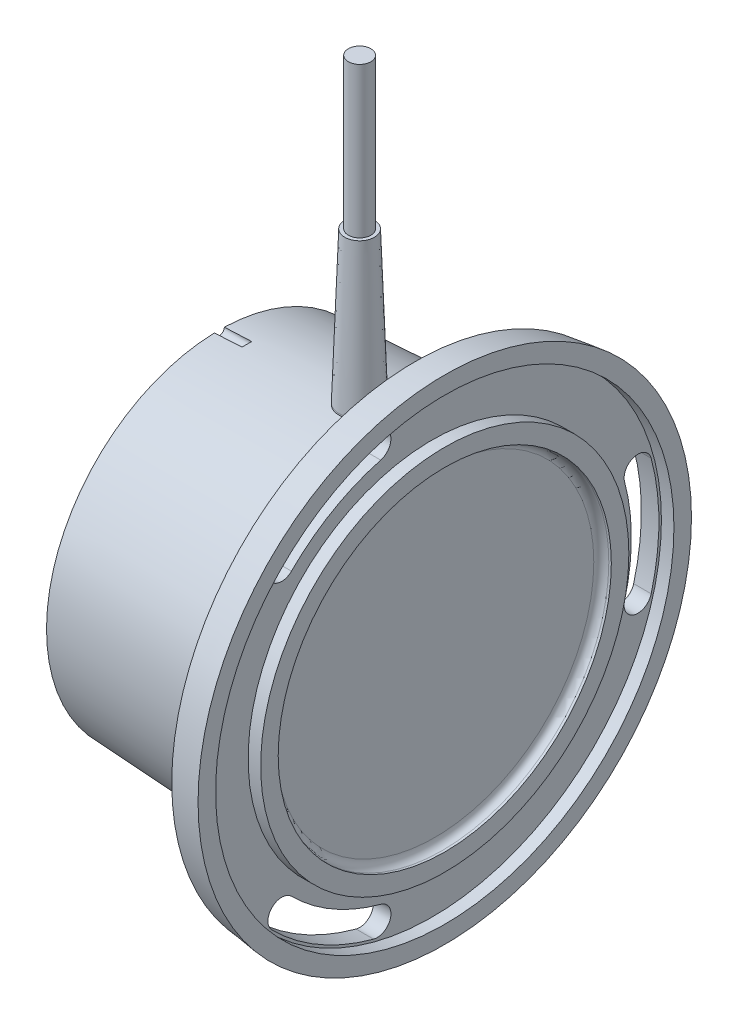
ISO-10303-21;
HEADER;
FILE_DESCRIPTION(('STEP AP214'),'2;1');
FILE_NAME('part.step','',(''),(''),'','','');
FILE_SCHEMA(('AUTOMOTIVE_DESIGN { 1 0 10303 214 1 1 1 1 }'));
ENDSEC;
DATA;
#1=APPLICATION_CONTEXT('core data for automotive mechanical design processes');
#2=APPLICATION_PROTOCOL_DEFINITION('international standard','automotive_design',2000,#1);
#3=PRODUCT_CONTEXT('',#1,'mechanical');
#4=PRODUCT('Part','Part','',(#3));
#5=PRODUCT_RELATED_PRODUCT_CATEGORY('part','',(#4));
#6=PRODUCT_DEFINITION_FORMATION('','',#4);
#7=PRODUCT_DEFINITION_CONTEXT('part definition',#1,'design');
#8=PRODUCT_DEFINITION('design','',#6,#7);
#9=PRODUCT_DEFINITION_SHAPE('','',#8);
#10=(LENGTH_UNIT() NAMED_UNIT(*) SI_UNIT(.MILLI.,.METRE.));
#11=(NAMED_UNIT(*) PLANE_ANGLE_UNIT() SI_UNIT($,.RADIAN.));
#12=(NAMED_UNIT(*) SI_UNIT($,.STERADIAN.) SOLID_ANGLE_UNIT());
#13=UNCERTAINTY_MEASURE_WITH_UNIT(LENGTH_MEASURE(1.E-05),#10,'distance_accuracy_value','');
#14=(GEOMETRIC_REPRESENTATION_CONTEXT(3) GLOBAL_UNCERTAINTY_ASSIGNED_CONTEXT((#13)) GLOBAL_UNIT_ASSIGNED_CONTEXT((#10,
#11,#12)) REPRESENTATION_CONTEXT('',''));
#15=CARTESIAN_POINT('',(0.,0.,0.));
#16=DIRECTION('',(0.,0.,1.));
#17=DIRECTION('',(1.,0.,0.));
#18=AXIS2_PLACEMENT_3D('',#15,#16,#17);
#19=CARTESIAN_POINT('',(28.,66.,0.));
#20=DIRECTION('',(0.,1.,0.));
#21=DIRECTION('',(0.,0.,1.));
#22=AXIS2_PLACEMENT_3D('',#19,#20,#21);
#23=PLANE('',#22);
#24=CARTESIAN_POINT('',(28.,66.,0.));
#25=DIRECTION('',(0.,1.,0.));
#26=DIRECTION('',(0.,0.,1.));
#27=AXIS2_PLACEMENT_3D('',#24,#25,#26);
#28=CIRCLE('',#27,2.95237691524758);
#29=CARTESIAN_POINT('',(28.,66.,2.95237691524758));
#30=VERTEX_POINT('',#29);
#31=EDGE_CURVE('E289',#30,#30,#28,.T.);
#32=ORIENTED_EDGE('',*,*,#31,.T.);
#33=EDGE_LOOP('',(#32));
#34=FACE_BOUND('',#33,.T.);
#35=CARTESIAN_POINT('',(28.,66.,0.));
#36=DIRECTION('',(0.,1.,0.));
#37=DIRECTION('',(0.,0.,1.));
#38=AXIS2_PLACEMENT_3D('',#35,#36,#37);
#39=CIRCLE('',#38,2.25);
#40=CARTESIAN_POINT('',(28.,66.,2.25));
#41=VERTEX_POINT('',#40);
#42=EDGE_CURVE('E281',#41,#41,#39,.T.);
#43=ORIENTED_EDGE('',*,*,#42,.F.);
#44=EDGE_LOOP('',(#43));
#45=FACE_BOUND('',#44,.T.);
#46=ADVANCED_FACE('F39',(#34,#45),#23,.T.);
#47=CARTESIAN_POINT('',(39.,0.,0.));
#48=DIRECTION('',(1.,0.,0.));
#49=DIRECTION('',(0.,0.,-1.));
#50=AXIS2_PLACEMENT_3D('',#47,#48,#49);
#51=CONICAL_SURFACE('',#50,36.5,0.0512371674034185);
#52=CARTESIAN_POINT('',(5.5002,34.7687218096424,-0.963217830515257));
#53=CARTESIAN_POINT('',(5.16734204294178,34.7515126146158,-0.968017715513699));
#54=CARTESIAN_POINT('',(4.83447649524155,34.7343156956424,-0.972319788754847));
#55=CARTESIAN_POINT('',(4.16873657126538,34.6999467406474,-0.979965061656519));
#56=CARTESIAN_POINT('',(3.83586219511793,34.6827747043679,-0.983308271328277));
#57=CARTESIAN_POINT('',(2.91914405483441,34.6355187324375,-0.991245575102052));
#58=CARTESIAN_POINT('',(2.33529050478183,34.6054605980492,-0.994882519406034));
#59=CARTESIAN_POINT('',(1.16755803085788,34.5454209802628,-0.999418047066386));
#60=CARTESIAN_POINT('',(0.583679106717657,34.5154394982784,-1.00031658027601));
#61=CARTESIAN_POINT('',(-0.000199999999913171,34.4854969899679,-0.999894825827186));
#62=B_SPLINE_CURVE_WITH_KNOTS('',3,(#52,#53,#54,#55,#56,#57,#58,#59,#60,#61),.UNSPECIFIED.,.F.,
.F.,(4,2,2,2,4),(0.,1.00001051321694,2.00001058521581,3.75391796812255,5.50785746900228),.UNSPECIFIED.);
#63=CARTESIAN_POINT('',(5.5,34.7687114693804,-0.963220715217156));
#64=VERTEX_POINT('',#63);
#65=CARTESIAN_POINT('',(0.,34.4855072463768,-0.999894974531004));
#66=VERTEX_POINT('',#65);
#67=EDGE_CURVE('E338',#64,#66,#62,.T.);
#68=ORIENTED_EDGE('',*,*,#67,.F.);
#69=CARTESIAN_POINT('',(5.5,0.,0.));
#70=DIRECTION('',(-1.,0.,0.));
#71=DIRECTION('',(0.,0.,1.));
#72=AXIS2_PLACEMENT_3D('',#69,#70,#71);
#73=CIRCLE('',#72,34.7820512820513);
#74=CARTESIAN_POINT('',(5.5,34.7687114693804,0.963220715217156));
#75=VERTEX_POINT('',#74);
#76=EDGE_CURVE('E54',#64,#75,#73,.F.);
#77=ORIENTED_EDGE('',*,*,#76,.T.);
#78=CARTESIAN_POINT('',(-0.000199999999993919,34.4854969899681,0.999894825819203));
#79=CARTESIAN_POINT('',(0.332699120070851,34.502568734654,1.00014192571287));
#80=CARTESIAN_POINT('',(0.665597790263742,34.5196531278215,0.999953259180684));
#81=CARTESIAN_POINT('',(1.33138877954517,34.5538469306266,0.998695719859313));
#82=CARTESIAN_POINT('',(1.66428109866387,34.5709563400077,0.997626856036208));
#83=CARTESIAN_POINT('',(2.58102964638199,34.6181086514903,0.993459361506711));
#84=CARTESIAN_POINT('',(3.16488066336798,34.6481775930621,0.989437990409768));
#85=CARTESIAN_POINT('',(4.33256219321329,34.7083923676219,0.978519800053021));
#86=CARTESIAN_POINT('',(4.91639270551966,34.7385382019746,0.971622929403483));
#87=CARTESIAN_POINT('',(5.5002,34.7687218096424,0.963217830515254));
#88=B_SPLINE_CURVE_WITH_KNOTS('',3,(#78,#79,#80,#81,#82,#83,#84,#85,#86,#87),.UNSPECIFIED.,.F.,
.F.,(4,2,2,2,4),(0.,1.00000943601882,2.00000868562691,3.75391729126552,5.50785724337385),.UNSPECIFIED.);
#89=CARTESIAN_POINT('',(0.,34.4855072463768,0.999894974531034));
#90=VERTEX_POINT('',#89);
#91=EDGE_CURVE('E331',#90,#75,#88,.T.);
#92=ORIENTED_EDGE('',*,*,#91,.F.);
#93=CARTESIAN_POINT('',(0.,0.,0.));
#94=DIRECTION('',(1.,0.,0.));
#95=DIRECTION('',(0.,0.,-1.));
#96=AXIS2_PLACEMENT_3D('',#93,#94,#95);
#97=CIRCLE('',#96,34.5);
#98=EDGE_CURVE('E345',#90,#66,#97,.T.);
#99=ORIENTED_EDGE('',*,*,#98,.T.);
#100=EDGE_LOOP('',(#68,#77,#92,#99));
#101=FACE_BOUND('',#100,.T.);
#102=CARTESIAN_POINT('',(39.,0.,0.));
#103=DIRECTION('',(1.,0.,0.));
#104=DIRECTION('',(0.,0.,-1.));
#105=AXIS2_PLACEMENT_3D('',#102,#103,#104);
#106=CIRCLE('',#105,36.5);
#107=CARTESIAN_POINT('',(39.,0.,-36.5));
#108=VERTEX_POINT('',#107);
#109=EDGE_CURVE('E349',#108,#108,#106,.T.);
#110=ORIENTED_EDGE('',*,*,#109,.F.);
#111=EDGE_LOOP('',(#110));
#112=FACE_BOUND('',#111,.T.);
#113=CARTESIAN_POINT('',(31.0558347950813,36.0002,2.58106057758639));
#114=CARTESIAN_POINT('',(30.9829624943268,35.9902672727489,2.66735260975896));
#115=CARTESIAN_POINT('',(30.9064405762152,35.9800556261139,2.7505215776685));
#116=CARTESIAN_POINT('',(30.7466719839248,35.9592823706909,2.910071888084));
#117=CARTESIAN_POINT('',(30.6634256711525,35.9487207807288,2.98645359491243));
#118=CARTESIAN_POINT('',(30.4908161686985,35.9274594971849,3.13186243648485));
#119=CARTESIAN_POINT('',(30.4014559281775,35.9167598721799,3.20089307663373));
#120=CARTESIAN_POINT('',(30.2172476885548,35.895425998792,3.33114924567909));
#121=CARTESIAN_POINT('',(30.1223997353143,35.8847917498635,3.39237483978921));
#122=CARTESIAN_POINT('',(29.8304853118112,35.8532779428769,3.56372436006317));
#123=CARTESIAN_POINT('',(29.6259738162335,35.8327779406242,3.66158364646448));
#124=CARTESIAN_POINT('',(29.2033293180839,35.7942910934065,3.82139996580729));
#125=CARTESIAN_POINT('',(28.9851998366279,35.7763036026596,3.88336623713577));
#126=CARTESIAN_POINT('',(28.5418974580251,35.7439732599101,3.96952968569834));
#127=CARTESIAN_POINT('',(28.3167443641397,35.7296210465707,3.99382471614747));
#128=CARTESIAN_POINT('',(27.8653088853739,35.7051752926775,4.0041035541207));
#129=CARTESIAN_POINT('',(27.6390263832743,35.6950822038786,3.99008329881642));
#130=CARTESIAN_POINT('',(27.1937070398581,35.6793986955458,3.92430183233382));
#131=CARTESIAN_POINT('',(26.9746267800652,35.6737729780478,3.87284276895653));
#132=CARTESIAN_POINT('',(26.5481313138362,35.6665862830101,3.73394844278099));
#133=CARTESIAN_POINT('',(26.3407152502303,35.6650250064028,3.64651582751784));
#134=CARTESIAN_POINT('',(25.9439509097445,35.6652452000315,3.43841852313303));
#135=CARTESIAN_POINT('',(25.7545590965082,35.6670183890871,3.31783679507882));
#136=CARTESIAN_POINT('',(25.3985907365055,35.672873978875,3.04675615804891));
#137=CARTESIAN_POINT('',(25.2320151157084,35.6769564732933,2.89625603547623));
#138=CARTESIAN_POINT('',(24.9258260511951,35.6862707526889,2.56901438307853));
#139=CARTESIAN_POINT('',(24.7863065502207,35.6915064118599,2.39218506197219));
#140=CARTESIAN_POINT('',(24.5388637024899,35.7019256205789,2.01765029149755));
#141=CARTESIAN_POINT('',(24.4309405336767,35.7071091698332,1.81994472456764));
#142=CARTESIAN_POINT('',(24.2495302789318,35.7163858390452,1.4087535776262));
#143=CARTESIAN_POINT('',(24.1761220668189,35.7204764523041,1.19523313276974));
#144=CARTESIAN_POINT('',(24.0662056397882,35.7267714097324,0.758870392723562));
#145=CARTESIAN_POINT('',(24.0296970657189,35.7289757722609,0.536028188286388));
#146=CARTESIAN_POINT('',(23.9946525520598,35.7310896328418,0.0876713175695218));
#147=CARTESIAN_POINT('',(23.9960651757178,35.7310022394622,-0.137839313980054));
#148=CARTESIAN_POINT('',(24.0366954731665,35.7285562570481,-0.585415220768946));
#149=CARTESIAN_POINT('',(24.0759130712265,35.7261976725632,-0.807480502909052));
#150=CARTESIAN_POINT('',(24.1909846395374,35.7196470954983,-1.24169713964061));
#151=CARTESIAN_POINT('',(24.2668111367126,35.7154564779863,-1.45385579790871));
#152=CARTESIAN_POINT('',(24.4529332365279,35.7060406346837,-1.86244907484916));
#153=CARTESIAN_POINT('',(24.563229324947,35.7008153943125,-2.05888347187091));
#154=CARTESIAN_POINT('',(24.8153872866784,35.690385831593,-2.43080272662581));
#155=CARTESIAN_POINT('',(24.9573011307726,35.6851815582146,-2.60625235301742));
#156=CARTESIAN_POINT('',(25.2685859414863,35.6760073363757,-2.93086060390249));
#157=CARTESIAN_POINT('',(25.4379569820889,35.6720373912412,-3.08001915755263));
#158=CARTESIAN_POINT('',(25.7993482623273,35.6665199941907,-3.34779063006853));
#159=CARTESIAN_POINT('',(25.9913663893216,35.6649723165046,-3.46640639484847));
#160=CARTESIAN_POINT('',(26.3925873816561,35.6653123702629,-3.66971367629691));
#161=CARTESIAN_POINT('',(26.6017896615073,35.6671999847083,-3.75440634819688));
#162=CARTESIAN_POINT('',(27.0305848989475,35.675090549797,-3.8872132736247));
#163=CARTESIAN_POINT('',(27.2501370754722,35.6810784307606,-3.93546011519584));
#164=CARTESIAN_POINT('',(27.6940504208894,35.6974175169125,-3.9945625806928));
#165=CARTESIAN_POINT('',(27.918411434052,35.7077685810053,-4.00541941362367));
#166=CARTESIAN_POINT('',(28.3652462752639,35.7326019704785,-3.98955015371189));
#167=CARTESIAN_POINT('',(28.5877222960208,35.7470785234974,-3.96287636960757));
#168=CARTESIAN_POINT('',(29.0249260272648,35.7794896486706,-3.87289834543561));
#169=CARTESIAN_POINT('',(29.2396520371211,35.7974249743926,-3.80958611687266));
#170=CARTESIAN_POINT('',(29.6566794888091,35.8357789385847,-3.64771004631082));
#171=CARTESIAN_POINT('',(29.8588938676461,35.8562125497036,-3.54892602704241));
#172=CARTESIAN_POINT('',(30.2437568256566,35.8980448599929,-3.31898904684544));
#173=CARTESIAN_POINT('',(30.4264239215302,35.9194426180418,-3.18786711514713));
#174=CARTESIAN_POINT('',(30.6794195624874,35.9507401680791,-2.97196484494406));
#175=CARTESIAN_POINT('',(30.7592031335042,35.9608929454702,-2.89803854800496));
#176=CARTESIAN_POINT('',(30.9123713260509,35.9808478437074,-2.7440570949395));
#177=CARTESIAN_POINT('',(30.9857673404295,35.9906505696851,-2.66401334976948));
#178=CARTESIAN_POINT('',(31.0558347950813,36.0002,-2.58106057758639));
#179=B_SPLINE_CURVE_WITH_KNOTS('',3,(#113,#114,#115,#116,#117,#118,#119,#120,#121,#122,#123,
#124,#125,#126,#127,#128,#129,#130,#131,#132,#133,#134,#135,#136,#137,#138,#139,#140,#141,#142,
#143,#144,#145,#146,#147,#148,#149,#150,#151,#152,#153,#154,#155,#156,#157,#158,#159,#160,#161,
#162,#163,#164,#165,#166,#167,#168,#169,#170,#171,#172,#173,#174,#175,#176,#177,#178),
.UNSPECIFIED.,.F.,.F.,(4,2,2,2,2,2,2,2,2,2,2,2,2,2,2,2,2,2,2,2,2,2,2,2,2,2,2,2,2,2,2,2,4),(0.,
0.34003162992082,0.680044996791593,1.01989549305935,1.3597431495825,2.03914891379344,
2.71837973015977,3.39584323203881,4.07337857273288,4.74550571518656,5.41758340013887,
6.08799417714353,6.75843215395555,7.43115786944948,8.10388737350456,8.77814682022477,
9.45239970417913,10.1257380699741,10.7990750869457,11.4719075830749,12.1447495618427,
12.8187057736358,13.4926638014278,14.1665590084555,14.8404312644169,15.5118400424954,
16.183227110383,16.8536793510486,17.5242778294623,18.1991128535441,18.8733028547369,
19.2007174693075,19.527535597753),.UNSPECIFIED.);
#180=CARTESIAN_POINT('',(31.0543672008937,36.,2.58279712755467));
#181=VERTEX_POINT('',#180);
#182=CARTESIAN_POINT('',(31.0543672008937,36.,-2.58279712755466));
#183=VERTEX_POINT('',#182);
#184=EDGE_CURVE('E11',#181,#183,#179,.T.);
#185=ORIENTED_EDGE('',*,*,#184,.T.);
#186=CARTESIAN_POINT('',(27.9833998795208,35.7105987931147,-4.01007175399731));
#187=CARTESIAN_POINT('',(28.0953593322982,35.7163417419881,-4.01034557312574));
#188=CARTESIAN_POINT('',(28.2072956218739,35.722622268723,-4.00589007800906));
#189=CARTESIAN_POINT('',(28.4303336115921,35.7361774512189,-3.98761805200315));
#190=CARTESIAN_POINT('',(28.5414353689007,35.7434520382186,-3.97380216833122));
#191=CARTESIAN_POINT('',(28.7621470447583,35.7589232142632,-3.93688768197473));
#192=CARTESIAN_POINT('',(28.8717552821482,35.7671207593093,-3.91377938931086));
#193=CARTESIAN_POINT('',(29.0885606636984,35.7843108853839,-3.85848131127856));
#194=CARTESIAN_POINT('',(29.1957578643721,35.7933034477531,-3.82629173901005));
#195=CARTESIAN_POINT('',(29.5151031773822,35.8214937984661,-3.71556629622748));
#196=CARTESIAN_POINT('',(29.7225624403276,35.8417299633842,-3.62328309256945));
#197=CARTESIAN_POINT('',(30.1183253893453,35.8834780301455,-3.40531621497951));
#198=CARTESIAN_POINT('',(30.3066746038733,35.9049866968961,-3.27971463234956));
#199=CARTESIAN_POINT('',(30.550579986323,35.9345126858434,-3.08550409181725));
#200=CARTESIAN_POINT('',(30.6164235052219,35.9426734586635,-3.02949021546776));
#201=CARTESIAN_POINT('',(30.7443732509471,35.9588600471778,-2.9133110074604));
#202=CARTESIAN_POINT('',(30.806478928548,35.9668858429146,-2.85314506848749));
#203=CARTESIAN_POINT('',(31.0225529190029,35.9953280284748,-2.62977390600937));
#204=CARTESIAN_POINT('',(31.1651672955805,36.0151049535421,-2.45518132277018));
#205=CARTESIAN_POINT('',(31.4194607878007,36.0515436737909,-2.08414022516438));
#206=CARTESIAN_POINT('',(31.5310822749109,36.0681996473952,-1.8876519354056));
#207=CARTESIAN_POINT('',(31.7199037465517,36.0969762980213,-1.47849510199219));
#208=CARTESIAN_POINT('',(31.7971143010317,36.1090983675307,-1.26583155039554));
#209=CARTESIAN_POINT('',(31.9147828663527,36.1277684496505,-0.830442611039278));
#210=CARTESIAN_POINT('',(31.9552586501584,36.1343191576925,-0.607722143815681));
#211=CARTESIAN_POINT('',(31.9981272247984,36.1412617648936,-0.16024441226727));
#212=CARTESIAN_POINT('',(32.0008041002316,36.1416996061383,0.0644849419335279));
#213=CARTESIAN_POINT('',(31.9687125848401,36.1364955084141,0.511242061171622));
#214=CARTESIAN_POINT('',(31.933935264284,36.1308521195739,0.733269169180551));
#215=CARTESIAN_POINT('',(31.8281865794448,36.11400123295,1.16744924563032));
#216=CARTESIAN_POINT('',(31.7573416441814,36.1028131746953,1.37963389925846));
#217=CARTESIAN_POINT('',(31.5816049320715,36.0758210941605,1.78897675305125));
#218=CARTESIAN_POINT('',(31.4767415814421,36.0600209269177,1.98614732990756));
#219=CARTESIAN_POINT('',(31.2851446796524,36.0322283828409,2.28391600427189));
#220=CARTESIAN_POINT('',(31.2083789655692,36.0213003064571,2.39118065140094));
#221=CARTESIAN_POINT('',(31.044791062201,35.9985998299687,2.59748113137976));
#222=CARTESIAN_POINT('',(30.9579846030626,35.9868287612532,2.69652942910811));
#223=CARTESIAN_POINT('',(30.8552850195916,35.9733102751546,2.80268989488496));
#224=CARTESIAN_POINT('',(30.8438974364009,35.9718165978068,2.81431833163313));
#225=CARTESIAN_POINT('',(30.7533387548289,35.959981387428,2.90567114175496));
#226=CARTESIAN_POINT('',(30.6708540912116,35.9494597531091,2.98216037740806));
#227=CARTESIAN_POINT('',(30.4997181627153,35.9282585005333,3.12795611742919));
#228=CARTESIAN_POINT('',(30.4110626214788,35.9175787768396,3.19725755621997));
#229=CARTESIAN_POINT('',(30.2279433349405,35.896236574523,3.3283606891612));
#230=CARTESIAN_POINT('',(30.1334626473711,35.8855742486596,3.39013878623833));
#231=CARTESIAN_POINT('',(29.9395996722736,35.8644995245834,3.50550341518781));
#232=CARTESIAN_POINT('',(29.8402173171037,35.8540871298225,3.55908983397511));
#233=CARTESIAN_POINT('',(29.6369377729765,35.8336695214189,3.65783277381456));
#234=CARTESIAN_POINT('',(29.5330279893266,35.8236656163996,3.70296364649488));
#235=CARTESIAN_POINT('',(29.3216974973321,35.8042706022348,3.78426516425104));
#236=CARTESIAN_POINT('',(29.2142765882966,35.7948795282102,3.820435296126));
#237=CARTESIAN_POINT('',(28.9969139009702,35.776884053955,3.88346825080975));
#238=CARTESIAN_POINT('',(28.8869777566887,35.768278076773,3.91035004733506));
#239=CARTESIAN_POINT('',(28.6651563340408,35.7519534316611,3.95471337374277));
#240=CARTESIAN_POINT('',(28.5532709809385,35.74423479784,3.97219454236664));
#241=CARTESIAN_POINT('',(28.4408073115007,35.737021322801,3.98487648383626));
#242=B_SPLINE_CURVE_WITH_KNOTS('',3,(#186,#187,#188,#189,#190,#191,#192,#193,#194,#195,#196,
#197,#198,#199,#200,#201,#202,#203,#204,#205,#206,#207,#208,#209,#210,#211,#212,#213,#214,#215,
#216,#217,#218,#219,#220,#221,#222,#223,#224,#225,#226,#227,#228,#229,#230,#231,#232,#233,#234,
#235,#236,#237,#238,#239,#240,#241),.UNSPECIFIED.,.F.,.F.,(4,2,2,2,2,2,2,2,2,2,2,2,2,2,2,2,2,2,
2,2,2,2,2,2,2,2,2,4),(0.,0.336208997956096,0.672394751356191,1.00893198690024,1.34546132596945,
2.02587329334808,2.70462415629729,2.96497117405067,3.22535635335817,3.90075290128563,
4.57739700515867,5.25383312188312,5.92994179150871,6.60096631494232,7.27215085771425,
7.94099870970565,8.60928909743015,9.00582244728399,9.40174278134973,9.45077628912493,
9.78926013305689,10.1279809242984,10.46773815601,10.807500077602,11.1482764859738,
11.4890724068331,11.8291679941681,12.1692766501681),.UNSPECIFIED.);
#243=EDGE_CURVE('E293',#183,#181,#242,.T.);
#244=ORIENTED_EDGE('',*,*,#243,.T.);
#245=EDGE_LOOP('',(#185,#244));
#246=FACE_BOUND('',#245,.T.);
#247=ADVANCED_FACE('F304',(#101,#112,#246),#51,.T.);
#248=CARTESIAN_POINT('',(43.,31.75,0.));
#249=DIRECTION('',(1.,0.,0.));
#250=DIRECTION('',(0.,0.,-1.));
#251=AXIS2_PLACEMENT_3D('',#248,#249,#250);
#252=PLANE('',#251);
#253=CARTESIAN_POINT('',(43.,0.,0.));
#254=DIRECTION('',(1.,0.,0.));
#255=DIRECTION('',(0.,0.,-1.));
#256=AXIS2_PLACEMENT_3D('',#253,#254,#255);
#257=CIRCLE('',#256,31.75);
#258=CARTESIAN_POINT('',(43.,0.,-31.75));
#259=VERTEX_POINT('',#258);
#260=EDGE_CURVE('E385',#259,#259,#257,.T.);
#261=ORIENTED_EDGE('',*,*,#260,.T.);
#262=EDGE_LOOP('',(#261));
#263=FACE_BOUND('',#262,.T.);
#264=ADVANCED_FACE('F41',(#263),#252,.T.);
#265=CARTESIAN_POINT('',(44.5,0.,0.));
#266=DIRECTION('',(1.,0.,0.));
#267=DIRECTION('',(0.,0.,-1.));
#268=AXIS2_PLACEMENT_3D('',#265,#266,#267);
#269=TOROIDAL_SURFACE('',#268,31.75,1.5);
#270=CARTESIAN_POINT('',(44.5,0.,0.));
#271=DIRECTION('',(1.,0.,0.));
#272=DIRECTION('',(0.,0.,-1.));
#273=AXIS2_PLACEMENT_3D('',#270,#271,#272);
#274=CIRCLE('',#273,33.25);
#275=CARTESIAN_POINT('',(44.5,0.,-33.25));
#276=VERTEX_POINT('',#275);
#277=EDGE_CURVE('E381',#276,#276,#274,.T.);
#278=ORIENTED_EDGE('',*,*,#277,.T.);
#279=EDGE_LOOP('',(#278));
#280=FACE_BOUND('',#279,.T.);
#281=ORIENTED_EDGE('',*,*,#260,.F.);
#282=EDGE_LOOP('',(#281));
#283=FACE_BOUND('',#282,.T.);
#284=ADVANCED_FACE('F413',(#280,#283),#269,.F.);
#285=CARTESIAN_POINT('',(104.922362869198,0.,0.));
#286=DIRECTION('',(1.,0.,0.));
#287=DIRECTION('',(0.,0.,-1.));
#288=AXIS2_PLACEMENT_3D('',#285,#286,#287);
#289=CYLINDRICAL_SURFACE('',#288,33.25);
#290=CARTESIAN_POINT('',(45.,0.,0.));
#291=DIRECTION('',(1.,0.,0.));
#292=DIRECTION('',(0.,0.,-1.));
#293=AXIS2_PLACEMENT_3D('',#290,#291,#292);
#294=CIRCLE('',#293,33.25);
#295=CARTESIAN_POINT('',(45.,0.,-33.25));
#296=VERTEX_POINT('',#295);
#297=EDGE_CURVE('E377',#296,#296,#294,.T.);
#298=ORIENTED_EDGE('',*,*,#297,.T.);
#299=EDGE_LOOP('',(#298));
#300=FACE_BOUND('',#299,.T.);
#301=ORIENTED_EDGE('',*,*,#277,.F.);
#302=EDGE_LOOP('',(#301));
#303=FACE_BOUND('',#302,.T.);
#304=ADVANCED_FACE('F515',(#300,#303),#289,.F.);
#305=CARTESIAN_POINT('',(45.,36.75,0.));
#306=DIRECTION('',(1.,0.,0.));
#307=DIRECTION('',(0.,0.,-1.));
#308=AXIS2_PLACEMENT_3D('',#305,#306,#307);
#309=PLANE('',#308);
#310=CARTESIAN_POINT('',(45.,0.,0.));
#311=DIRECTION('',(1.,0.,0.));
#312=DIRECTION('',(0.,0.,-1.));
#313=AXIS2_PLACEMENT_3D('',#310,#311,#312);
#314=CIRCLE('',#313,36.75);
#315=CARTESIAN_POINT('',(45.,0.,-36.75));
#316=VERTEX_POINT('',#315);
#317=EDGE_CURVE('E373',#316,#316,#314,.T.);
#318=ORIENTED_EDGE('',*,*,#317,.T.);
#319=EDGE_LOOP('',(#318));
#320=FACE_BOUND('',#319,.T.);
#321=ORIENTED_EDGE('',*,*,#297,.F.);
#322=EDGE_LOOP('',(#321));
#323=FACE_BOUND('',#322,.T.);
#324=ADVANCED_FACE('F509',(#320,#323),#309,.T.);
#325=CARTESIAN_POINT('',(104.922362869198,0.,0.));
#326=DIRECTION('',(1.,0.,0.));
#327=DIRECTION('',(0.,0.,-1.));
#328=AXIS2_PLACEMENT_3D('',#325,#326,#327);
#329=CYLINDRICAL_SURFACE('',#328,36.75);
#330=CARTESIAN_POINT('',(42.5,0.,0.));
#331=DIRECTION('',(1.,0.,0.));
#332=DIRECTION('',(0.,0.,-1.));
#333=AXIS2_PLACEMENT_3D('',#330,#331,#332);
#334=CIRCLE('',#333,36.75);
#335=CARTESIAN_POINT('',(42.5,0.,-36.75));
#336=VERTEX_POINT('',#335);
#337=EDGE_CURVE('E369',#336,#336,#334,.T.);
#338=ORIENTED_EDGE('',*,*,#337,.T.);
#339=EDGE_LOOP('',(#338));
#340=FACE_BOUND('',#339,.T.);
#341=ORIENTED_EDGE('',*,*,#317,.F.);
#342=EDGE_LOOP('',(#341));
#343=FACE_BOUND('',#342,.T.);
#344=ADVANCED_FACE('F493',(#340,#343),#329,.T.);
#345=CARTESIAN_POINT('',(42.5,45.75,0.));
#346=DIRECTION('',(1.,0.,0.));
#347=DIRECTION('',(0.,0.,-1.));
#348=AXIS2_PLACEMENT_3D('',#345,#346,#347);
#349=PLANE('',#348);
#350=CARTESIAN_POINT('',(42.5,0.,0.));
#351=DIRECTION('',(1.,0.,0.));
#352=DIRECTION('',(0.,0.,-1.));
#353=AXIS2_PLACEMENT_3D('',#350,#351,#352);
#354=CIRCLE('',#353,45.25);
#355=CARTESIAN_POINT('',(42.5,43.7081980100518,11.711358875643));
#356=VERTEX_POINT('',#355);
#357=CARTESIAN_POINT('',(42.5,31.9964333041697,31.9967303925233));
#358=VERTEX_POINT('',#357);
#359=EDGE_CURVE('E197',#356,#358,#354,.T.);
#360=ORIENTED_EDGE('',*,*,#359,.F.);
#361=CARTESIAN_POINT('',(42.5,41.0518986834741,10.9996188334768));
#362=DIRECTION('',(1.,0.,0.));
#363=DIRECTION('',(0.,0.,-1.));
#364=AXIS2_PLACEMENT_3D('',#361,#362,#363);
#365=CIRCLE('',#364,2.74999999999999);
#366=CARTESIAN_POINT('',(42.5,38.3955993568964,10.2878787913107));
#367=VERTEX_POINT('',#366);
#368=EDGE_CURVE('E185',#367,#356,#365,.T.);
#369=ORIENTED_EDGE('',*,*,#368,.F.);
#370=CARTESIAN_POINT('',(42.5,0.,0.));
#371=DIRECTION('',(1.,0.,0.));
#372=DIRECTION('',(0.,0.,-1.));
#373=AXIS2_PLACEMENT_3D('',#370,#371,#372);
#374=CIRCLE('',#373,39.75);
#375=CARTESIAN_POINT('',(42.5,28.1073640627789,28.1076250409459));
#376=VERTEX_POINT('',#375);
#377=EDGE_CURVE('E158',#376,#367,#374,.F.);
#378=ORIENTED_EDGE('',*,*,#377,.F.);
#379=CARTESIAN_POINT('',(42.5,30.0518986834743,30.0521777167346));
#380=DIRECTION('',(1.,0.,0.));
#381=DIRECTION('',(0.,0.,-1.));
#382=AXIS2_PLACEMENT_3D('',#379,#380,#381);
#383=CIRCLE('',#382,2.74999999999999);
#384=EDGE_CURVE('E194',#358,#376,#383,.T.);
#385=ORIENTED_EDGE('',*,*,#384,.F.);
#386=EDGE_LOOP('',(#360,#369,#378,#385));
#387=FACE_BOUND('',#386,.T.);
#388=CARTESIAN_POINT('',(42.5,0.,0.));
#389=DIRECTION('',(1.,0.,0.));
#390=DIRECTION('',(0.,0.,-1.));
#391=AXIS2_PLACEMENT_3D('',#388,#389,#390);
#392=CIRCLE('',#391,45.25);
#393=CARTESIAN_POINT('',(42.5,-31.9964333041692,31.9967303925237));
#394=VERTEX_POINT('',#393);
#395=CARTESIAN_POINT('',(42.5,-43.7081980100517,11.7113588756436));
#396=VERTEX_POINT('',#395);
#397=EDGE_CURVE('E237',#394,#396,#392,.T.);
#398=ORIENTED_EDGE('',*,*,#397,.F.);
#399=CARTESIAN_POINT('',(42.5,-30.0518986834739,30.052177716735));
#400=DIRECTION('',(1.,0.,0.));
#401=DIRECTION('',(0.,0.,-1.));
#402=AXIS2_PLACEMENT_3D('',#399,#400,#401);
#403=CIRCLE('',#402,2.74999999999999);
#404=CARTESIAN_POINT('',(42.5,-28.1073640627785,28.1076250409463));
#405=VERTEX_POINT('',#404);
#406=EDGE_CURVE('E218',#405,#394,#403,.T.);
#407=ORIENTED_EDGE('',*,*,#406,.F.);
#408=CARTESIAN_POINT('',(42.5,0.,0.));
#409=DIRECTION('',(1.,0.,0.));
#410=DIRECTION('',(0.,0.,-1.));
#411=AXIS2_PLACEMENT_3D('',#408,#409,#410);
#412=CIRCLE('',#411,39.75);
#413=CARTESIAN_POINT('',(42.5,-38.3955993568962,10.2878787913112));
#414=VERTEX_POINT('',#413);
#415=EDGE_CURVE('E230',#414,#405,#412,.F.);
#416=ORIENTED_EDGE('',*,*,#415,.F.);
#417=CARTESIAN_POINT('',(42.5,-41.051898683474,10.9996188334774));
#418=DIRECTION('',(1.,0.,0.));
#419=DIRECTION('',(0.,0.,-1.));
#420=AXIS2_PLACEMENT_3D('',#417,#418,#419);
#421=CIRCLE('',#420,2.74999999999999);
#422=EDGE_CURVE('E234',#396,#414,#421,.T.);
#423=ORIENTED_EDGE('',*,*,#422,.F.);
#424=EDGE_LOOP('',(#398,#407,#416,#423));
#425=FACE_BOUND('',#424,.T.);
#426=CARTESIAN_POINT('',(42.5,0.,0.));
#427=DIRECTION('',(1.,0.,0.));
#428=DIRECTION('',(0.,0.,-1.));
#429=AXIS2_PLACEMENT_3D('',#426,#427,#428);
#430=CIRCLE('',#429,45.25);
#431=CARTESIAN_POINT('',(42.5,-11.7117647058824,-43.7080892681669));
#432=VERTEX_POINT('',#431);
#433=CARTESIAN_POINT('',(42.5,11.7117647058823,-43.7080892681669));
#434=VERTEX_POINT('',#433);
#435=EDGE_CURVE('E278',#432,#434,#430,.T.);
#436=ORIENTED_EDGE('',*,*,#435,.F.);
#437=CARTESIAN_POINT('',(42.5,-11.,-41.051796550212));
#438=DIRECTION('',(1.,0.,0.));
#439=DIRECTION('',(0.,0.,-1.));
#440=AXIS2_PLACEMENT_3D('',#437,#438,#439);
#441=CIRCLE('',#440,2.74999999999999);
#442=CARTESIAN_POINT('',(42.5,-10.2882352941177,-38.3955038322571));
#443=VERTEX_POINT('',#442);
#444=EDGE_CURVE('E259',#443,#432,#441,.T.);
#445=ORIENTED_EDGE('',*,*,#444,.F.);
#446=CARTESIAN_POINT('',(42.5,0.,0.));
#447=DIRECTION('',(1.,0.,0.));
#448=DIRECTION('',(0.,0.,-1.));
#449=AXIS2_PLACEMENT_3D('',#446,#447,#448);
#450=CIRCLE('',#449,39.75);
#451=CARTESIAN_POINT('',(42.5,10.2882352941176,-38.3955038322571));
#452=VERTEX_POINT('',#451);
#453=EDGE_CURVE('E271',#452,#443,#450,.F.);
#454=ORIENTED_EDGE('',*,*,#453,.F.);
#455=CARTESIAN_POINT('',(42.5,11.,-41.051796550212));
#456=DIRECTION('',(1.,0.,0.));
#457=DIRECTION('',(0.,0.,-1.));
#458=AXIS2_PLACEMENT_3D('',#455,#456,#457);
#459=CIRCLE('',#458,2.74999999999999);
#460=EDGE_CURVE('E275',#434,#452,#459,.T.);
#461=ORIENTED_EDGE('',*,*,#460,.F.);
#462=EDGE_LOOP('',(#436,#445,#454,#461));
#463=FACE_BOUND('',#462,.T.);
#464=CARTESIAN_POINT('',(42.5,0.,0.));
#465=DIRECTION('',(1.,0.,0.));
#466=DIRECTION('',(0.,0.,-1.));
#467=AXIS2_PLACEMENT_3D('',#464,#465,#466);
#468=CIRCLE('',#467,45.75);
#469=CARTESIAN_POINT('',(42.5,0.,-45.75));
#470=VERTEX_POINT('',#469);
#471=EDGE_CURVE('E365',#470,#470,#468,.T.);
#472=ORIENTED_EDGE('',*,*,#471,.T.);
#473=EDGE_LOOP('',(#472));
#474=FACE_BOUND('',#473,.T.);
#475=ORIENTED_EDGE('',*,*,#337,.F.);
#476=EDGE_LOOP('',(#475));
#477=FACE_BOUND('',#476,.T.);
#478=ADVANCED_FACE('F480',(#387,#425,#463,#474,#477),#349,.T.);
#479=CARTESIAN_POINT('',(104.922362869198,0.,0.));
#480=DIRECTION('',(1.,0.,0.));
#481=DIRECTION('',(0.,0.,-1.));
#482=AXIS2_PLACEMENT_3D('',#479,#480,#481);
#483=CYLINDRICAL_SURFACE('',#482,45.75);
#484=CARTESIAN_POINT('',(45.,0.,0.));
#485=DIRECTION('',(1.,0.,0.));
#486=DIRECTION('',(0.,0.,-1.));
#487=AXIS2_PLACEMENT_3D('',#484,#485,#486);
#488=CIRCLE('',#487,45.75);
#489=CARTESIAN_POINT('',(45.,0.,-45.75));
#490=VERTEX_POINT('',#489);
#491=EDGE_CURVE('E361',#490,#490,#488,.T.);
#492=ORIENTED_EDGE('',*,*,#491,.T.);
#493=EDGE_LOOP('',(#492));
#494=FACE_BOUND('',#493,.T.);
#495=ORIENTED_EDGE('',*,*,#471,.F.);
#496=EDGE_LOOP('',(#495));
#497=FACE_BOUND('',#496,.T.);
#498=ADVANCED_FACE('F492',(#494,#497),#483,.F.);
#499=CARTESIAN_POINT('',(45.,49.25,0.));
#500=DIRECTION('',(1.,0.,0.));
#501=DIRECTION('',(0.,0.,-1.));
#502=AXIS2_PLACEMENT_3D('',#499,#500,#501);
#503=PLANE('',#502);
#504=CARTESIAN_POINT('',(45.,0.,0.));
#505=DIRECTION('',(1.,0.,0.));
#506=DIRECTION('',(0.,0.,-1.));
#507=AXIS2_PLACEMENT_3D('',#504,#505,#506);
#508=CIRCLE('',#507,49.25);
#509=CARTESIAN_POINT('',(45.,0.,-49.25));
#510=VERTEX_POINT('',#509);
#511=EDGE_CURVE('E357',#510,#510,#508,.T.);
#512=ORIENTED_EDGE('',*,*,#511,.T.);
#513=EDGE_LOOP('',(#512));
#514=FACE_BOUND('',#513,.T.);
#515=ORIENTED_EDGE('',*,*,#491,.F.);
#516=EDGE_LOOP('',(#515));
#517=FACE_BOUND('',#516,.T.);
#518=ADVANCED_FACE('F532',(#514,#517),#503,.T.);
#519=CARTESIAN_POINT('',(45.,0.,0.));
#520=DIRECTION('',(1.,0.,0.));
#521=DIRECTION('',(0.,0.,-1.));
#522=AXIS2_PLACEMENT_3D('',#519,#520,#521);
#523=CONICAL_SURFACE('',#522,49.25,0.124354994546762);
#524=CARTESIAN_POINT('',(39.,0.,0.));
#525=DIRECTION('',(1.,0.,0.));
#526=DIRECTION('',(0.,0.,-1.));
#527=AXIS2_PLACEMENT_3D('',#524,#525,#526);
#528=CIRCLE('',#527,48.5);
#529=CARTESIAN_POINT('',(39.,0.,-48.5));
#530=VERTEX_POINT('',#529);
#531=EDGE_CURVE('E353',#530,#530,#528,.T.);
#532=ORIENTED_EDGE('',*,*,#531,.T.);
#533=EDGE_LOOP('',(#532));
#534=FACE_BOUND('',#533,.T.);
#535=ORIENTED_EDGE('',*,*,#511,.F.);
#536=EDGE_LOOP('',(#535));
#537=FACE_BOUND('',#536,.T.);
#538=ADVANCED_FACE('F536',(#534,#537),#523,.T.);
#539=CARTESIAN_POINT('',(39.,36.5,0.));
#540=DIRECTION('',(-1.,0.,0.));
#541=DIRECTION('',(0.,0.,1.));
#542=AXIS2_PLACEMENT_3D('',#539,#540,#541);
#543=PLANE('',#542);
#544=CARTESIAN_POINT('',(39.,0.,0.));
#545=DIRECTION('',(-1.,0.,0.));
#546=DIRECTION('',(0.,-0.866025403784443,-0.499999999999992));
#547=AXIS2_PLACEMENT_3D('',#544,#545,#546);
#548=CIRCLE('',#547,45.25);
#549=CARTESIAN_POINT('',(39.,31.9964333041697,31.9967303925233));
#550=VERTEX_POINT('',#549);
#551=CARTESIAN_POINT('',(39.,43.7081980100518,11.711358875643));
#552=VERTEX_POINT('',#551);
#553=EDGE_CURVE('E69',#550,#552,#548,.T.);
#554=ORIENTED_EDGE('',*,*,#553,.F.);
#555=CARTESIAN_POINT('',(39.,30.0518986834743,30.0521777167346));
#556=DIRECTION('',(-1.,0.,0.));
#557=DIRECTION('',(0.,-0.866025403784443,-0.499999999999992));
#558=AXIS2_PLACEMENT_3D('',#555,#556,#557);
#559=CIRCLE('',#558,2.74999999999999);
#560=CARTESIAN_POINT('',(39.,28.1073640627789,28.1076250409459));
#561=VERTEX_POINT('',#560);
#562=EDGE_CURVE('E173',#561,#550,#559,.T.);
#563=ORIENTED_EDGE('',*,*,#562,.F.);
#564=CARTESIAN_POINT('',(39.,0.,0.));
#565=DIRECTION('',(1.,0.,0.));
#566=DIRECTION('',(0.,-0.866025403784443,-0.499999999999992));
#567=AXIS2_PLACEMENT_3D('',#564,#565,#566);
#568=CIRCLE('',#567,39.75);
#569=CARTESIAN_POINT('',(39.,38.3955993568964,10.2878787913107));
#570=VERTEX_POINT('',#569);
#571=EDGE_CURVE('E155',#570,#561,#568,.T.);
#572=ORIENTED_EDGE('',*,*,#571,.F.);
#573=CARTESIAN_POINT('',(39.,41.0518986834741,10.9996188334768));
#574=DIRECTION('',(-1.,0.,0.));
#575=DIRECTION('',(0.,0.866025403784443,0.499999999999992));
#576=AXIS2_PLACEMENT_3D('',#573,#574,#575);
#577=CIRCLE('',#576,2.74999999999999);
#578=EDGE_CURVE('E165',#552,#570,#577,.T.);
#579=ORIENTED_EDGE('',*,*,#578,.F.);
#580=EDGE_LOOP('',(#554,#563,#572,#579));
#581=FACE_BOUND('',#580,.T.);
#582=CARTESIAN_POINT('',(39.,0.,0.));
#583=DIRECTION('',(-1.,0.,0.));
#584=DIRECTION('',(0.,0.866025403784436,-0.500000000000004));
#585=AXIS2_PLACEMENT_3D('',#582,#583,#584);
#586=CIRCLE('',#585,45.25);
#587=CARTESIAN_POINT('',(39.,-43.7081980100517,11.7113588756436));
#588=VERTEX_POINT('',#587);
#589=CARTESIAN_POINT('',(39.,-31.9964333041692,31.9967303925237));
#590=VERTEX_POINT('',#589);
#591=EDGE_CURVE('E200',#588,#590,#586,.T.);
#592=ORIENTED_EDGE('',*,*,#591,.F.);
#593=CARTESIAN_POINT('',(39.,-41.051898683474,10.9996188334774));
#594=DIRECTION('',(-1.,0.,0.));
#595=DIRECTION('',(0.,0.866025403784436,-0.500000000000004));
#596=AXIS2_PLACEMENT_3D('',#593,#594,#595);
#597=CIRCLE('',#596,2.74999999999999);
#598=CARTESIAN_POINT('',(39.,-38.3955993568962,10.2878787913112));
#599=VERTEX_POINT('',#598);
#600=EDGE_CURVE('E211',#599,#588,#597,.T.);
#601=ORIENTED_EDGE('',*,*,#600,.F.);
#602=CARTESIAN_POINT('',(39.,0.,0.));
#603=DIRECTION('',(1.,0.,0.));
#604=DIRECTION('',(0.,0.866025403784436,-0.500000000000004));
#605=AXIS2_PLACEMENT_3D('',#602,#603,#604);
#606=CIRCLE('',#605,39.75);
#607=CARTESIAN_POINT('',(39.,-28.1073640627785,28.1076250409463));
#608=VERTEX_POINT('',#607);
#609=EDGE_CURVE('E207',#608,#599,#606,.T.);
#610=ORIENTED_EDGE('',*,*,#609,.F.);
#611=CARTESIAN_POINT('',(39.,-30.0518986834739,30.052177716735));
#612=DIRECTION('',(-1.,0.,0.));
#613=DIRECTION('',(0.,-0.866025403784436,0.500000000000004));
#614=AXIS2_PLACEMENT_3D('',#611,#612,#613);
#615=CIRCLE('',#614,2.74999999999999);
#616=EDGE_CURVE('E203',#590,#608,#615,.T.);
#617=ORIENTED_EDGE('',*,*,#616,.F.);
#618=EDGE_LOOP('',(#592,#601,#610,#617));
#619=FACE_BOUND('',#618,.T.);
#620=CARTESIAN_POINT('',(39.,0.,0.));
#621=DIRECTION('',(-1.,0.,0.));
#622=DIRECTION('',(0.,0.,1.));
#623=AXIS2_PLACEMENT_3D('',#620,#621,#622);
#624=CIRCLE('',#623,45.25);
#625=CARTESIAN_POINT('',(39.,11.7117647058823,-43.7080892681669));
#626=VERTEX_POINT('',#625);
#627=CARTESIAN_POINT('',(39.,-11.7117647058824,-43.7080892681669));
#628=VERTEX_POINT('',#627);
#629=EDGE_CURVE('E240',#626,#628,#624,.T.);
#630=ORIENTED_EDGE('',*,*,#629,.F.);
#631=CARTESIAN_POINT('',(39.,11.,-41.051796550212));
#632=DIRECTION('',(-1.,0.,0.));
#633=DIRECTION('',(0.,0.,1.));
#634=AXIS2_PLACEMENT_3D('',#631,#632,#633);
#635=CIRCLE('',#634,2.74999999999999);
#636=CARTESIAN_POINT('',(39.,10.2882352941176,-38.3955038322571));
#637=VERTEX_POINT('',#636);
#638=EDGE_CURVE('E251',#637,#626,#635,.T.);
#639=ORIENTED_EDGE('',*,*,#638,.F.);
#640=CARTESIAN_POINT('',(39.,0.,0.));
#641=DIRECTION('',(1.,0.,0.));
#642=DIRECTION('',(0.,0.,1.));
#643=AXIS2_PLACEMENT_3D('',#640,#641,#642);
#644=CIRCLE('',#643,39.75);
#645=CARTESIAN_POINT('',(39.,-10.2882352941177,-38.3955038322571));
#646=VERTEX_POINT('',#645);
#647=EDGE_CURVE('E247',#646,#637,#644,.T.);
#648=ORIENTED_EDGE('',*,*,#647,.F.);
#649=CARTESIAN_POINT('',(39.,-11.,-41.051796550212));
#650=DIRECTION('',(-1.,0.,0.));
#651=DIRECTION('',(0.,0.,-1.));
#652=AXIS2_PLACEMENT_3D('',#649,#650,#651);
#653=CIRCLE('',#652,2.74999999999999);
#654=EDGE_CURVE('E243',#628,#646,#653,.T.);
#655=ORIENTED_EDGE('',*,*,#654,.F.);
#656=EDGE_LOOP('',(#630,#639,#648,#655));
#657=FACE_BOUND('',#656,.T.);
#658=ORIENTED_EDGE('',*,*,#109,.T.);
#659=EDGE_LOOP('',(#658));
#660=FACE_BOUND('',#659,.T.);
#661=ORIENTED_EDGE('',*,*,#531,.F.);
#662=EDGE_LOOP('',(#661));
#663=FACE_BOUND('',#662,.T.);
#664=ADVANCED_FACE('F170',(#581,#619,#657,#660,#663),#543,.T.);
#665=CARTESIAN_POINT('',(0.,0.,0.));
#666=DIRECTION('',(-1.,0.,0.));
#667=DIRECTION('',(0.,0.,1.));
#668=AXIS2_PLACEMENT_3D('',#665,#666,#667);
#669=PLANE('',#668);
#670=CARTESIAN_POINT('',(0.,34.5,0.));
#671=DIRECTION('',(-1.,0.,0.));
#672=DIRECTION('',(0.,0.,1.));
#673=AXIS2_PLACEMENT_3D('',#670,#671,#672);
#674=CIRCLE('',#673,1.);
#675=EDGE_CURVE('E399',#66,#90,#674,.T.);
#676=ORIENTED_EDGE('',*,*,#675,.F.);
#677=ORIENTED_EDGE('',*,*,#98,.F.);
#678=EDGE_LOOP('',(#676,#677));
#679=FACE_BOUND('',#678,.T.);
#680=ADVANCED_FACE('F327',(#679),#669,.T.);
#681=CARTESIAN_POINT('',(5.5,34.5,0.));
#682=DIRECTION('',(-1.,0.,0.));
#683=DIRECTION('',(0.,0.,1.));
#684=AXIS2_PLACEMENT_3D('',#681,#682,#683);
#685=CYLINDRICAL_SURFACE('',#684,1.);
#686=ORIENTED_EDGE('',*,*,#67,.T.);
#687=ORIENTED_EDGE('',*,*,#675,.T.);
#688=ORIENTED_EDGE('',*,*,#91,.T.);
#689=CARTESIAN_POINT('',(5.5,34.5,0.));
#690=DIRECTION('',(-1.,0.,0.));
#691=DIRECTION('',(0.,0.,1.));
#692=AXIS2_PLACEMENT_3D('',#689,#690,#691);
#693=CIRCLE('',#692,1.);
#694=EDGE_CURVE('E397',#64,#75,#693,.T.);
#695=ORIENTED_EDGE('',*,*,#694,.F.);
#696=EDGE_LOOP('',(#686,#687,#688,#695));
#697=FACE_BOUND('',#696,.T.);
#698=ADVANCED_FACE('F323',(#697),#685,.F.);
#699=CARTESIAN_POINT('',(5.5,34.5,0.));
#700=DIRECTION('',(-1.,0.,0.));
#701=DIRECTION('',(0.,0.,1.));
#702=AXIS2_PLACEMENT_3D('',#699,#700,#701);
#703=PLANE('',#702);
#704=ORIENTED_EDGE('',*,*,#694,.T.);
#705=ORIENTED_EDGE('',*,*,#76,.F.);
#706=EDGE_LOOP('',(#704,#705));
#707=FACE_BOUND('',#706,.T.);
#708=ADVANCED_FACE('F319',(#707),#703,.T.);
#709=CARTESIAN_POINT('',(28.,36.,0.));
#710=DIRECTION('',(0.,-1.,0.));
#711=DIRECTION('',(0.,0.,-1.));
#712=AXIS2_PLACEMENT_3D('',#709,#710,#711);
#713=CYLINDRICAL_SURFACE('',#712,4.00000000000001);
#714=ORIENTED_EDGE('',*,*,#184,.F.);
#715=CARTESIAN_POINT('',(28.,36.,0.));
#716=DIRECTION('',(0.,1.,0.));
#717=DIRECTION('',(0.,0.,1.));
#718=AXIS2_PLACEMENT_3D('',#715,#716,#717);
#719=CIRCLE('',#718,4.00000000000001);
#720=EDGE_CURVE('E302',#183,#181,#719,.T.);
#721=ORIENTED_EDGE('',*,*,#720,.F.);
#722=EDGE_LOOP('',(#714,#721));
#723=FACE_BOUND('',#722,.T.);
#724=ADVANCED_FACE('F313',(#723),#713,.T.);
#725=CARTESIAN_POINT('',(28.,36.,0.));
#726=DIRECTION('',(0.,-1.,0.));
#727=DIRECTION('',(0.,0.,1.));
#728=AXIS2_PLACEMENT_3D('',#725,#726,#727);
#729=CONICAL_SURFACE('',#728,4.00000000000001,0.0349065850398867);
#730=ORIENTED_EDGE('',*,*,#243,.F.);
#731=ORIENTED_EDGE('',*,*,#720,.T.);
#732=EDGE_LOOP('',(#730,#731));
#733=FACE_BOUND('',#732,.T.);
#734=ORIENTED_EDGE('',*,*,#31,.F.);
#735=EDGE_LOOP('',(#734));
#736=FACE_BOUND('',#735,.T.);
#737=ADVANCED_FACE('F308',(#733,#736),#729,.T.);
#738=CARTESIAN_POINT('',(28.,96.,0.));
#739=DIRECTION('',(0.,-1.,0.));
#740=DIRECTION('',(0.,0.,-1.));
#741=AXIS2_PLACEMENT_3D('',#738,#739,#740);
#742=CYLINDRICAL_SURFACE('',#741,2.25);
#743=CARTESIAN_POINT('',(28.,96.,0.));
#744=DIRECTION('',(0.,1.,0.));
#745=DIRECTION('',(0.,0.,1.));
#746=AXIS2_PLACEMENT_3D('',#743,#744,#745);
#747=CIRCLE('',#746,2.25);
#748=CARTESIAN_POINT('',(28.,96.,2.25));
#749=VERTEX_POINT('',#748);
#750=EDGE_CURVE('E285',#749,#749,#747,.T.);
#751=ORIENTED_EDGE('',*,*,#750,.F.);
#752=EDGE_LOOP('',(#751));
#753=FACE_BOUND('',#752,.T.);
#754=ORIENTED_EDGE('',*,*,#42,.T.);
#755=EDGE_LOOP('',(#754));
#756=FACE_BOUND('',#755,.T.);
#757=ADVANCED_FACE('F312',(#753,#756),#742,.T.);
#758=CARTESIAN_POINT('',(28.,96.,0.));
#759=DIRECTION('',(0.,1.,0.));
#760=DIRECTION('',(0.,0.,1.));
#761=AXIS2_PLACEMENT_3D('',#758,#759,#760);
#762=PLANE('',#761);
#763=ORIENTED_EDGE('',*,*,#750,.T.);
#764=EDGE_LOOP('',(#763));
#765=FACE_BOUND('',#764,.T.);
#766=ADVANCED_FACE('F423',(#765),#762,.T.);
#767=CARTESIAN_POINT('',(45.,0.,0.));
#768=DIRECTION('',(-1.,0.,0.));
#769=DIRECTION('',(0.,0.,1.));
#770=AXIS2_PLACEMENT_3D('',#767,#768,#769);
#771=CYLINDRICAL_SURFACE('',#770,45.25);
#772=ORIENTED_EDGE('',*,*,#435,.T.);
#773=DIRECTION('',(-1.,0.,0.));
#774=VECTOR('',#773,1.);
#775=CARTESIAN_POINT('',(45.,11.7117647058823,-43.7080892681669));
#776=LINE('',#775,#774);
#777=EDGE_CURVE('E256',#434,#626,#776,.T.);
#778=ORIENTED_EDGE('',*,*,#777,.T.);
#779=ORIENTED_EDGE('',*,*,#629,.T.);
#780=DIRECTION('',(-1.,0.,0.));
#781=VECTOR('',#780,1.);
#782=CARTESIAN_POINT('',(45.,-11.7117647058824,-43.7080892681669));
#783=LINE('',#782,#781);
#784=EDGE_CURVE('E255',#432,#628,#783,.T.);
#785=ORIENTED_EDGE('',*,*,#784,.F.);
#786=EDGE_LOOP('',(#772,#778,#779,#785));
#787=FACE_BOUND('',#786,.T.);
#788=ADVANCED_FACE('F428',(#787),#771,.F.);
#789=CARTESIAN_POINT('',(45.,11.,-41.051796550212));
#790=DIRECTION('',(-1.,0.,0.));
#791=DIRECTION('',(0.,0.,1.));
#792=AXIS2_PLACEMENT_3D('',#789,#790,#791);
#793=CYLINDRICAL_SURFACE('',#792,2.74999999999999);
#794=ORIENTED_EDGE('',*,*,#460,.T.);
#795=DIRECTION('',(-1.,0.,0.));
#796=VECTOR('',#795,1.);
#797=CARTESIAN_POINT('',(45.,10.2882352941176,-38.3955038322571));
#798=LINE('',#797,#796);
#799=EDGE_CURVE('E260',#452,#637,#798,.T.);
#800=ORIENTED_EDGE('',*,*,#799,.T.);
#801=ORIENTED_EDGE('',*,*,#638,.T.);
#802=ORIENTED_EDGE('',*,*,#777,.F.);
#803=EDGE_LOOP('',(#794,#800,#801,#802));
#804=FACE_BOUND('',#803,.T.);
#805=ADVANCED_FACE('F435',(#804),#793,.F.);
#806=CARTESIAN_POINT('',(45.,0.,0.));
#807=DIRECTION('',(-1.,0.,0.));
#808=DIRECTION('',(0.,0.,1.));
#809=AXIS2_PLACEMENT_3D('',#806,#807,#808);
#810=CYLINDRICAL_SURFACE('',#809,39.75);
#811=ORIENTED_EDGE('',*,*,#453,.T.);
#812=DIRECTION('',(-1.,0.,0.));
#813=VECTOR('',#812,1.);
#814=CARTESIAN_POINT('',(45.,-10.2882352941177,-38.3955038322571));
#815=LINE('',#814,#813);
#816=EDGE_CURVE('E263',#443,#646,#815,.T.);
#817=ORIENTED_EDGE('',*,*,#816,.T.);
#818=ORIENTED_EDGE('',*,*,#647,.T.);
#819=ORIENTED_EDGE('',*,*,#799,.F.);
#820=EDGE_LOOP('',(#811,#817,#818,#819));
#821=FACE_BOUND('',#820,.T.);
#822=ADVANCED_FACE('F441',(#821),#810,.T.);
#823=CARTESIAN_POINT('',(45.,-11.,-41.051796550212));
#824=DIRECTION('',(-1.,0.,0.));
#825=DIRECTION('',(0.,0.,1.));
#826=AXIS2_PLACEMENT_3D('',#823,#824,#825);
#827=CYLINDRICAL_SURFACE('',#826,2.74999999999999);
#828=ORIENTED_EDGE('',*,*,#444,.T.);
#829=ORIENTED_EDGE('',*,*,#784,.T.);
#830=ORIENTED_EDGE('',*,*,#654,.T.);
#831=ORIENTED_EDGE('',*,*,#816,.F.);
#832=EDGE_LOOP('',(#828,#829,#830,#831));
#833=FACE_BOUND('',#832,.T.);
#834=ADVANCED_FACE('F437',(#833),#827,.F.);
#835=CARTESIAN_POINT('',(45.,0.,0.));
#836=DIRECTION('',(-1.,0.,0.));
#837=DIRECTION('',(0.,0.,1.));
#838=AXIS2_PLACEMENT_3D('',#835,#836,#837);
#839=CYLINDRICAL_SURFACE('',#838,45.25);
#840=ORIENTED_EDGE('',*,*,#397,.T.);
#841=DIRECTION('',(-1.,0.,0.));
#842=VECTOR('',#841,1.);
#843=CARTESIAN_POINT('',(45.,-43.7081980100517,11.7113588756436));
#844=LINE('',#843,#842);
#845=EDGE_CURVE('E216',#396,#588,#844,.T.);
#846=ORIENTED_EDGE('',*,*,#845,.T.);
#847=ORIENTED_EDGE('',*,*,#591,.T.);
#848=DIRECTION('',(-1.,0.,0.));
#849=VECTOR('',#848,1.);
#850=CARTESIAN_POINT('',(45.,-31.9964333041692,31.9967303925237));
#851=LINE('',#850,#849);
#852=EDGE_CURVE('E215',#394,#590,#851,.T.);
#853=ORIENTED_EDGE('',*,*,#852,.F.);
#854=EDGE_LOOP('',(#840,#846,#847,#853));
#855=FACE_BOUND('',#854,.T.);
#856=ADVANCED_FACE('F440',(#855),#839,.F.);
#857=CARTESIAN_POINT('',(45.,-41.051898683474,10.9996188334774));
#858=DIRECTION('',(-1.,0.,0.));
#859=DIRECTION('',(0.,0.,1.));
#860=AXIS2_PLACEMENT_3D('',#857,#858,#859);
#861=CYLINDRICAL_SURFACE('',#860,2.74999999999999);
#862=ORIENTED_EDGE('',*,*,#422,.T.);
#863=DIRECTION('',(-1.,0.,0.));
#864=VECTOR('',#863,1.);
#865=CARTESIAN_POINT('',(45.,-38.3955993568962,10.2878787913112));
#866=LINE('',#865,#864);
#867=EDGE_CURVE('E219',#414,#599,#866,.T.);
#868=ORIENTED_EDGE('',*,*,#867,.T.);
#869=ORIENTED_EDGE('',*,*,#600,.T.);
#870=ORIENTED_EDGE('',*,*,#845,.F.);
#871=EDGE_LOOP('',(#862,#868,#869,#870));
#872=FACE_BOUND('',#871,.T.);
#873=ADVANCED_FACE('F451',(#872),#861,.F.);
#874=CARTESIAN_POINT('',(45.,0.,0.));
#875=DIRECTION('',(-1.,0.,0.));
#876=DIRECTION('',(0.,0.,1.));
#877=AXIS2_PLACEMENT_3D('',#874,#875,#876);
#878=CYLINDRICAL_SURFACE('',#877,39.75);
#879=ORIENTED_EDGE('',*,*,#415,.T.);
#880=DIRECTION('',(-1.,0.,0.));
#881=VECTOR('',#880,1.);
#882=CARTESIAN_POINT('',(45.,-28.1073640627785,28.1076250409463));
#883=LINE('',#882,#881);
#884=EDGE_CURVE('E222',#405,#608,#883,.T.);
#885=ORIENTED_EDGE('',*,*,#884,.T.);
#886=ORIENTED_EDGE('',*,*,#609,.T.);
#887=ORIENTED_EDGE('',*,*,#867,.F.);
#888=EDGE_LOOP('',(#879,#885,#886,#887));
#889=FACE_BOUND('',#888,.T.);
#890=ADVANCED_FACE('F457',(#889),#878,.T.);
#891=CARTESIAN_POINT('',(45.,-30.0518986834739,30.052177716735));
#892=DIRECTION('',(-1.,0.,0.));
#893=DIRECTION('',(0.,0.,1.));
#894=AXIS2_PLACEMENT_3D('',#891,#892,#893);
#895=CYLINDRICAL_SURFACE('',#894,2.74999999999999);
#896=ORIENTED_EDGE('',*,*,#406,.T.);
#897=ORIENTED_EDGE('',*,*,#852,.T.);
#898=ORIENTED_EDGE('',*,*,#616,.T.);
#899=ORIENTED_EDGE('',*,*,#884,.F.);
#900=EDGE_LOOP('',(#896,#897,#898,#899));
#901=FACE_BOUND('',#900,.T.);
#902=ADVANCED_FACE('F453',(#901),#895,.F.);
#903=CARTESIAN_POINT('',(45.,0.,0.));
#904=DIRECTION('',(-1.,0.,0.));
#905=DIRECTION('',(0.,0.,1.));
#906=AXIS2_PLACEMENT_3D('',#903,#904,#905);
#907=CYLINDRICAL_SURFACE('',#906,45.25);
#908=ORIENTED_EDGE('',*,*,#359,.T.);
#909=DIRECTION('',(-1.,0.,0.));
#910=VECTOR('',#909,1.);
#911=CARTESIAN_POINT('',(45.,31.9964333041697,31.9967303925233));
#912=LINE('',#911,#910);
#913=EDGE_CURVE('E182',#358,#550,#912,.T.);
#914=ORIENTED_EDGE('',*,*,#913,.T.);
#915=ORIENTED_EDGE('',*,*,#553,.T.);
#916=DIRECTION('',(-1.,0.,0.));
#917=VECTOR('',#916,1.);
#918=CARTESIAN_POINT('',(45.,43.7081980100518,11.711358875643));
#919=LINE('',#918,#917);
#920=EDGE_CURVE('E162',#356,#552,#919,.T.);
#921=ORIENTED_EDGE('',*,*,#920,.F.);
#922=EDGE_LOOP('',(#908,#914,#915,#921));
#923=FACE_BOUND('',#922,.T.);
#924=ADVANCED_FACE('F456',(#923),#907,.F.);
#925=CARTESIAN_POINT('',(45.,30.0518986834743,30.0521777167346));
#926=DIRECTION('',(-1.,0.,0.));
#927=DIRECTION('',(0.,0.,1.));
#928=AXIS2_PLACEMENT_3D('',#925,#926,#927);
#929=CYLINDRICAL_SURFACE('',#928,2.74999999999999);
#930=ORIENTED_EDGE('',*,*,#384,.T.);
#931=DIRECTION('',(-1.,0.,0.));
#932=VECTOR('',#931,1.);
#933=CARTESIAN_POINT('',(45.,28.1073640627789,28.1076250409459));
#934=LINE('',#933,#932);
#935=EDGE_CURVE('E161',#376,#561,#934,.T.);
#936=ORIENTED_EDGE('',*,*,#935,.T.);
#937=ORIENTED_EDGE('',*,*,#562,.T.);
#938=ORIENTED_EDGE('',*,*,#913,.F.);
#939=EDGE_LOOP('',(#930,#936,#937,#938));
#940=FACE_BOUND('',#939,.T.);
#941=ADVANCED_FACE('F467',(#940),#929,.F.);
#942=CARTESIAN_POINT('',(45.,0.,0.));
#943=DIRECTION('',(-1.,0.,0.));
#944=DIRECTION('',(0.,0.,1.));
#945=AXIS2_PLACEMENT_3D('',#942,#943,#944);
#946=CYLINDRICAL_SURFACE('',#945,39.75);
#947=ORIENTED_EDGE('',*,*,#377,.T.);
#948=DIRECTION('',(-1.,0.,0.));
#949=VECTOR('',#948,1.);
#950=CARTESIAN_POINT('',(45.,38.3955993568964,10.2878787913107));
#951=LINE('',#950,#949);
#952=EDGE_CURVE('E61',#367,#570,#951,.T.);
#953=ORIENTED_EDGE('',*,*,#952,.T.);
#954=ORIENTED_EDGE('',*,*,#571,.T.);
#955=ORIENTED_EDGE('',*,*,#935,.F.);
#956=EDGE_LOOP('',(#947,#953,#954,#955));
#957=FACE_BOUND('',#956,.T.);
#958=ADVANCED_FACE('F152',(#957),#946,.T.);
#959=CARTESIAN_POINT('',(45.,41.0518986834741,10.9996188334768));
#960=DIRECTION('',(-1.,0.,0.));
#961=DIRECTION('',(0.,0.,1.));
#962=AXIS2_PLACEMENT_3D('',#959,#960,#961);
#963=CYLINDRICAL_SURFACE('',#962,2.74999999999999);
#964=ORIENTED_EDGE('',*,*,#368,.T.);
#965=ORIENTED_EDGE('',*,*,#920,.T.);
#966=ORIENTED_EDGE('',*,*,#578,.T.);
#967=ORIENTED_EDGE('',*,*,#952,.F.);
#968=EDGE_LOOP('',(#964,#965,#966,#967));
#969=FACE_BOUND('',#968,.T.);
#970=ADVANCED_FACE('F166',(#969),#963,.F.);
#971=CLOSED_SHELL('',(#46,#247,#264,#284,#304,#324,#344,#478,#498,#518,#538,#664,#680,#698,#708,
#724,#737,#757,#766,#788,#805,#822,#834,#856,#873,#890,#902,#924,#941,#958,#970));
#972=MANIFOLD_SOLID_BREP('B2',#971);
#973=ADVANCED_BREP_SHAPE_REPRESENTATION('',(#18,#972),#14);
#974=SHAPE_DEFINITION_REPRESENTATION(#9,#973);
ENDSEC;
END-ISO-10303-21;
